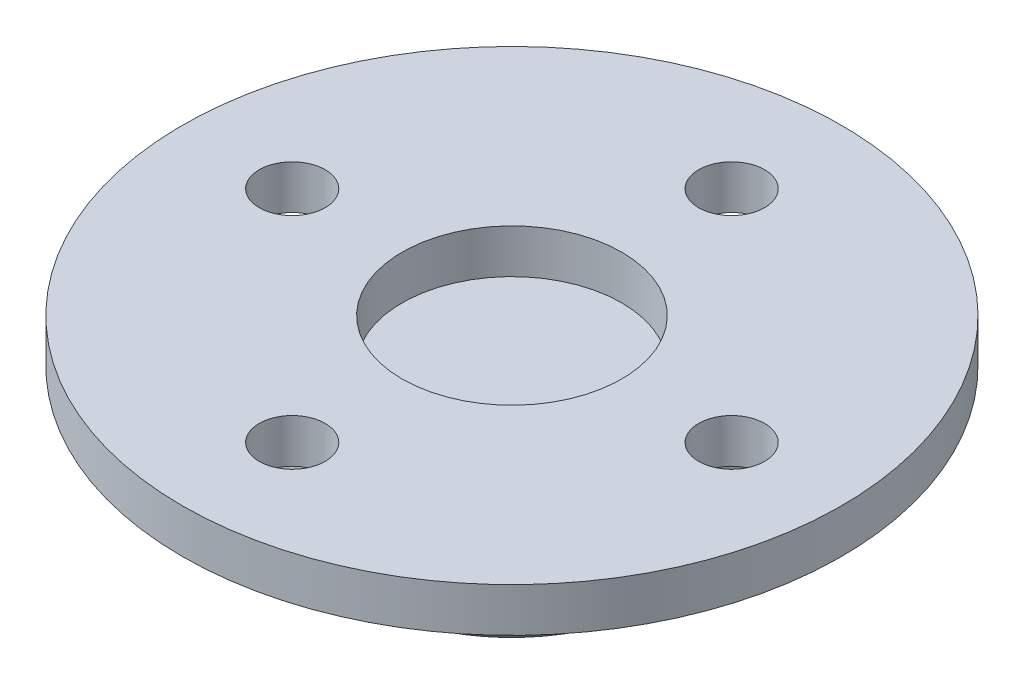
ISO-10303-21;
HEADER;
FILE_DESCRIPTION(('STEP AP214'),'2;1');
FILE_NAME('part.step','',(''),(''),'','','');
FILE_SCHEMA(('AUTOMOTIVE_DESIGN { 1 0 10303 214 1 1 1 1 }'));
ENDSEC;
DATA;
#1=APPLICATION_CONTEXT('core data for automotive mechanical design processes');
#2=APPLICATION_PROTOCOL_DEFINITION('international standard','automotive_design',2000,#1);
#3=PRODUCT_CONTEXT('',#1,'mechanical');
#4=PRODUCT('Part','Part','',(#3));
#5=PRODUCT_RELATED_PRODUCT_CATEGORY('part','',(#4));
#6=PRODUCT_DEFINITION_FORMATION('','',#4);
#7=PRODUCT_DEFINITION_CONTEXT('part definition',#1,'design');
#8=PRODUCT_DEFINITION('design','',#6,#7);
#9=PRODUCT_DEFINITION_SHAPE('','',#8);
#10=(LENGTH_UNIT() NAMED_UNIT(*) SI_UNIT(.MILLI.,.METRE.));
#11=(NAMED_UNIT(*) PLANE_ANGLE_UNIT() SI_UNIT($,.RADIAN.));
#12=(NAMED_UNIT(*) SI_UNIT($,.STERADIAN.) SOLID_ANGLE_UNIT());
#13=UNCERTAINTY_MEASURE_WITH_UNIT(LENGTH_MEASURE(1.E-05),#10,'distance_accuracy_value','');
#14=(GEOMETRIC_REPRESENTATION_CONTEXT(3) GLOBAL_UNCERTAINTY_ASSIGNED_CONTEXT((#13)) GLOBAL_UNIT_ASSIGNED_CONTEXT((#10,
#11,#12)) REPRESENTATION_CONTEXT('',''));
#15=CARTESIAN_POINT('',(0.,0.,0.));
#16=DIRECTION('',(0.,0.,1.));
#17=DIRECTION('',(1.,0.,0.));
#18=AXIS2_PLACEMENT_3D('',#15,#16,#17);
#19=CARTESIAN_POINT('',(0.,-2.54,0.));
#20=DIRECTION('',(0.,1.,0.));
#21=DIRECTION('',(0.,0.,1.));
#22=AXIS2_PLACEMENT_3D('',#19,#20,#21);
#23=CYLINDRICAL_SURFACE('',#22,19.05);
#24=CARTESIAN_POINT('',(0.,-2.54,0.));
#25=DIRECTION('',(0.,1.,0.));
#26=DIRECTION('',(0.,0.,1.));
#27=AXIS2_PLACEMENT_3D('',#24,#25,#26);
#28=CIRCLE('',#27,19.05);
#29=CARTESIAN_POINT('',(0.,-2.54,19.05));
#30=VERTEX_POINT('',#29);
#31=EDGE_CURVE('E59',#30,#30,#28,.T.);
#32=ORIENTED_EDGE('',*,*,#31,.T.);
#33=EDGE_LOOP('',(#32));
#34=FACE_BOUND('',#33,.T.);
#35=CARTESIAN_POINT('',(0.,0.,0.));
#36=DIRECTION('',(0.,1.,0.));
#37=DIRECTION('',(0.,0.,1.));
#38=AXIS2_PLACEMENT_3D('',#35,#36,#37);
#39=CIRCLE('',#38,19.05);
#40=CARTESIAN_POINT('',(0.,0.,19.05));
#41=VERTEX_POINT('',#40);
#42=EDGE_CURVE('E60',#41,#41,#39,.T.);
#43=ORIENTED_EDGE('',*,*,#42,.F.);
#44=EDGE_LOOP('',(#43));
#45=FACE_BOUND('',#44,.T.);
#46=ADVANCED_FACE('F39',(#34,#45),#23,.T.);
#47=CARTESIAN_POINT('',(0.,-2.54,0.));
#48=DIRECTION('',(0.,1.,0.));
#49=DIRECTION('',(0.,0.,1.));
#50=AXIS2_PLACEMENT_3D('',#47,#48,#49);
#51=PLANE('',#50);
#52=CARTESIAN_POINT('',(0.,-2.54,0.));
#53=DIRECTION('',(0.,1.,0.));
#54=DIRECTION('',(0.,0.,1.));
#55=AXIS2_PLACEMENT_3D('',#52,#53,#54);
#56=CIRCLE('',#55,10.16);
#57=CARTESIAN_POINT('',(0.,-2.54,10.16));
#58=VERTEX_POINT('',#57);
#59=EDGE_CURVE('E53',#58,#58,#56,.F.);
#60=ORIENTED_EDGE('',*,*,#59,.F.);
#61=EDGE_LOOP('',(#60));
#62=FACE_BOUND('',#61,.T.);
#63=CARTESIAN_POINT('',(-12.6999999999996,-2.54,3.60178059048672E-13));
#64=DIRECTION('',(0.,1.,0.));
#65=DIRECTION('',(0.,0.,1.));
#66=AXIS2_PLACEMENT_3D('',#63,#64,#65);
#67=CIRCLE('',#66,1.90500000000058);
#68=CARTESIAN_POINT('',(-12.6999999999996,-2.54,1.90500000000094));
#69=VERTEX_POINT('',#68);
#70=EDGE_CURVE('E96',#69,#69,#67,.T.);
#71=ORIENTED_EDGE('',*,*,#70,.T.);
#72=EDGE_LOOP('',(#71));
#73=FACE_BOUND('',#72,.T.);
#74=CARTESIAN_POINT('',(7.1724551522751E-13,-2.54,12.7));
#75=DIRECTION('',(0.,1.,0.));
#76=DIRECTION('',(0.,0.,1.));
#77=AXIS2_PLACEMENT_3D('',#74,#75,#76);
#78=CIRCLE('',#77,1.90500000000077);
#79=CARTESIAN_POINT('',(7.1724551522751E-13,-2.54,14.6050000000008));
#80=VERTEX_POINT('',#79);
#81=EDGE_CURVE('E88',#80,#80,#78,.T.);
#82=ORIENTED_EDGE('',*,*,#81,.T.);
#83=EDGE_LOOP('',(#82));
#84=FACE_BOUND('',#83,.T.);
#85=CARTESIAN_POINT('',(12.7000000000004,-2.54,-3.58622757613755E-13));
#86=DIRECTION('',(0.,1.,0.));
#87=DIRECTION('',(0.,0.,1.));
#88=AXIS2_PLACEMENT_3D('',#85,#86,#87);
#89=CIRCLE('',#88,1.90500000000028);
#90=CARTESIAN_POINT('',(12.7000000000004,-2.54,1.90499999999992));
#91=VERTEX_POINT('',#90);
#92=EDGE_CURVE('E80',#91,#91,#89,.T.);
#93=ORIENTED_EDGE('',*,*,#92,.T.);
#94=EDGE_LOOP('',(#93));
#95=FACE_BOUND('',#94,.T.);
#96=CARTESIAN_POINT('',(0.,-2.54,-12.7));
#97=DIRECTION('',(0.,1.,0.));
#98=DIRECTION('',(0.,0.,1.));
#99=AXIS2_PLACEMENT_3D('',#96,#97,#98);
#100=CIRCLE('',#99,1.905);
#101=CARTESIAN_POINT('',(0.,-2.54,-10.795));
#102=VERTEX_POINT('',#101);
#103=EDGE_CURVE('E72',#102,#102,#100,.T.);
#104=ORIENTED_EDGE('',*,*,#103,.T.);
#105=EDGE_LOOP('',(#104));
#106=FACE_BOUND('',#105,.T.);
#107=ORIENTED_EDGE('',*,*,#31,.F.);
#108=EDGE_LOOP('',(#107));
#109=FACE_BOUND('',#108,.T.);
#110=ADVANCED_FACE('F108',(#62,#73,#84,#95,#106,#109),#51,.F.);
#111=CARTESIAN_POINT('',(0.,0.,0.));
#112=DIRECTION('',(0.,1.,0.));
#113=DIRECTION('',(0.,0.,1.));
#114=AXIS2_PLACEMENT_3D('',#111,#112,#113);
#115=PLANE('',#114);
#116=CARTESIAN_POINT('',(-12.6999999999996,0.,3.60178059048672E-13));
#117=DIRECTION('',(0.,1.,0.));
#118=DIRECTION('',(0.,0.,1.));
#119=AXIS2_PLACEMENT_3D('',#116,#117,#118);
#120=CIRCLE('',#119,1.90500000000058);
#121=CARTESIAN_POINT('',(-12.6999999999996,0.,1.90500000000094));
#122=VERTEX_POINT('',#121);
#123=EDGE_CURVE('E100',#122,#122,#120,.T.);
#124=ORIENTED_EDGE('',*,*,#123,.F.);
#125=EDGE_LOOP('',(#124));
#126=FACE_BOUND('',#125,.T.);
#127=CARTESIAN_POINT('',(7.1724551522751E-13,0.,12.7));
#128=DIRECTION('',(0.,1.,0.));
#129=DIRECTION('',(0.,0.,1.));
#130=AXIS2_PLACEMENT_3D('',#127,#128,#129);
#131=CIRCLE('',#130,1.90500000000077);
#132=CARTESIAN_POINT('',(7.1724551522751E-13,0.,14.6050000000008));
#133=VERTEX_POINT('',#132);
#134=EDGE_CURVE('E92',#133,#133,#131,.T.);
#135=ORIENTED_EDGE('',*,*,#134,.F.);
#136=EDGE_LOOP('',(#135));
#137=FACE_BOUND('',#136,.T.);
#138=CARTESIAN_POINT('',(12.7000000000004,0.,-3.58622757613755E-13));
#139=DIRECTION('',(0.,1.,0.));
#140=DIRECTION('',(0.,0.,1.));
#141=AXIS2_PLACEMENT_3D('',#138,#139,#140);
#142=CIRCLE('',#141,1.90500000000028);
#143=CARTESIAN_POINT('',(12.7000000000004,0.,1.90499999999992));
#144=VERTEX_POINT('',#143);
#145=EDGE_CURVE('E84',#144,#144,#142,.T.);
#146=ORIENTED_EDGE('',*,*,#145,.F.);
#147=EDGE_LOOP('',(#146));
#148=FACE_BOUND('',#147,.T.);
#149=CARTESIAN_POINT('',(0.,0.,-12.7));
#150=DIRECTION('',(0.,1.,0.));
#151=DIRECTION('',(0.,0.,1.));
#152=AXIS2_PLACEMENT_3D('',#149,#150,#151);
#153=CIRCLE('',#152,1.905);
#154=CARTESIAN_POINT('',(0.,0.,-10.795));
#155=VERTEX_POINT('',#154);
#156=EDGE_CURVE('E76',#155,#155,#153,.T.);
#157=ORIENTED_EDGE('',*,*,#156,.F.);
#158=EDGE_LOOP('',(#157));
#159=FACE_BOUND('',#158,.T.);
#160=CARTESIAN_POINT('',(0.,0.,0.));
#161=DIRECTION('',(0.,1.,0.));
#162=DIRECTION('',(0.,0.,1.));
#163=AXIS2_PLACEMENT_3D('',#160,#161,#162);
#164=CIRCLE('',#163,6.35);
#165=CARTESIAN_POINT('',(0.,0.,6.35));
#166=VERTEX_POINT('',#165);
#167=EDGE_CURVE('E68',#166,#166,#164,.T.);
#168=ORIENTED_EDGE('',*,*,#167,.F.);
#169=EDGE_LOOP('',(#168));
#170=FACE_BOUND('',#169,.T.);
#171=ORIENTED_EDGE('',*,*,#42,.T.);
#172=EDGE_LOOP('',(#171));
#173=FACE_BOUND('',#172,.T.);
#174=ADVANCED_FACE('F119',(#126,#137,#148,#159,#170,#173),#115,.T.);
#175=CARTESIAN_POINT('',(0.,-2.54,0.));
#176=DIRECTION('',(0.,1.,0.));
#177=DIRECTION('',(0.,0.,1.));
#178=AXIS2_PLACEMENT_3D('',#175,#176,#177);
#179=CYLINDRICAL_SURFACE('',#178,6.35);
#180=CARTESIAN_POINT('',(0.,-2.54,0.));
#181=DIRECTION('',(0.,1.,0.));
#182=DIRECTION('',(0.,0.,1.));
#183=AXIS2_PLACEMENT_3D('',#180,#181,#182);
#184=CIRCLE('',#183,6.35);
#185=CARTESIAN_POINT('',(0.,-2.54,6.35));
#186=VERTEX_POINT('',#185);
#187=EDGE_CURVE('E64',#186,#186,#184,.T.);
#188=ORIENTED_EDGE('',*,*,#187,.F.);
#189=EDGE_LOOP('',(#188));
#190=FACE_BOUND('',#189,.T.);
#191=ORIENTED_EDGE('',*,*,#167,.T.);
#192=EDGE_LOOP('',(#191));
#193=FACE_BOUND('',#192,.T.);
#194=ADVANCED_FACE('F122',(#190,#193),#179,.F.);
#195=CARTESIAN_POINT('',(0.,-2.54,-12.7));
#196=DIRECTION('',(0.,1.,0.));
#197=DIRECTION('',(0.,0.,1.));
#198=AXIS2_PLACEMENT_3D('',#195,#196,#197);
#199=CYLINDRICAL_SURFACE('',#198,1.905);
#200=ORIENTED_EDGE('',*,*,#103,.F.);
#201=EDGE_LOOP('',(#200));
#202=FACE_BOUND('',#201,.T.);
#203=ORIENTED_EDGE('',*,*,#156,.T.);
#204=EDGE_LOOP('',(#203));
#205=FACE_BOUND('',#204,.T.);
#206=ADVANCED_FACE('F144',(#202,#205),#199,.F.);
#207=CARTESIAN_POINT('',(12.7000000000004,-2.54,-3.58622757613755E-13));
#208=DIRECTION('',(0.,1.,0.));
#209=DIRECTION('',(0.,0.,1.));
#210=AXIS2_PLACEMENT_3D('',#207,#208,#209);
#211=CYLINDRICAL_SURFACE('',#210,1.90500000000028);
#212=ORIENTED_EDGE('',*,*,#92,.F.);
#213=EDGE_LOOP('',(#212));
#214=FACE_BOUND('',#213,.T.);
#215=ORIENTED_EDGE('',*,*,#145,.T.);
#216=EDGE_LOOP('',(#215));
#217=FACE_BOUND('',#216,.T.);
#218=ADVANCED_FACE('F148',(#214,#217),#211,.F.);
#219=CARTESIAN_POINT('',(7.1724551522751E-13,-2.54,12.7));
#220=DIRECTION('',(0.,1.,0.));
#221=DIRECTION('',(0.,0.,1.));
#222=AXIS2_PLACEMENT_3D('',#219,#220,#221);
#223=CYLINDRICAL_SURFACE('',#222,1.90500000000077);
#224=ORIENTED_EDGE('',*,*,#81,.F.);
#225=EDGE_LOOP('',(#224));
#226=FACE_BOUND('',#225,.T.);
#227=ORIENTED_EDGE('',*,*,#134,.T.);
#228=EDGE_LOOP('',(#227));
#229=FACE_BOUND('',#228,.T.);
#230=ADVANCED_FACE('F115',(#226,#229),#223,.F.);
#231=CARTESIAN_POINT('',(-12.6999999999996,-2.54,3.60178059048672E-13));
#232=DIRECTION('',(0.,1.,0.));
#233=DIRECTION('',(0.,0.,1.));
#234=AXIS2_PLACEMENT_3D('',#231,#232,#233);
#235=CYLINDRICAL_SURFACE('',#234,1.90500000000058);
#236=ORIENTED_EDGE('',*,*,#70,.F.);
#237=EDGE_LOOP('',(#236));
#238=FACE_BOUND('',#237,.T.);
#239=ORIENTED_EDGE('',*,*,#123,.T.);
#240=EDGE_LOOP('',(#239));
#241=FACE_BOUND('',#240,.T.);
#242=ADVANCED_FACE('F111',(#238,#241),#235,.F.);
#243=CARTESIAN_POINT('',(0.,-2.54,0.));
#244=DIRECTION('',(0.,-1.,0.));
#245=DIRECTION('',(0.,0.,-1.));
#246=AXIS2_PLACEMENT_3D('',#243,#244,#245);
#247=PLANE('',#246);
#248=ORIENTED_EDGE('',*,*,#187,.T.);
#249=EDGE_LOOP('',(#248));
#250=FACE_BOUND('',#249,.T.);
#251=ADVANCED_FACE('F114',(#250),#247,.F.);
#252=CARTESIAN_POINT('',(0.,-10.16,0.));
#253=DIRECTION('',(0.,1.,0.));
#254=DIRECTION('',(0.,0.,1.));
#255=AXIS2_PLACEMENT_3D('',#252,#253,#254);
#256=CYLINDRICAL_SURFACE('',#255,10.16);
#257=CARTESIAN_POINT('',(0.,-7.62,0.));
#258=DIRECTION('',(0.,-1.,0.));
#259=DIRECTION('',(0.,0.,-1.));
#260=AXIS2_PLACEMENT_3D('',#257,#258,#259);
#261=CIRCLE('',#260,10.16);
#262=CARTESIAN_POINT('',(0.,-7.62,10.16));
#263=VERTEX_POINT('',#262);
#264=EDGE_CURVE('E10',#263,#263,#261,.F.);
#265=CARTESIAN_POINT('',(0.,-7.62,10.16));
#266=CARTESIAN_POINT('',(0.,-7.56708333333333,10.16));
#267=CARTESIAN_POINT('',(0.,-7.51416666666666,10.16));
#268=CARTESIAN_POINT('',(0.,-7.40833333333333,10.16));
#269=CARTESIAN_POINT('',(0.,-7.35541666666666,10.16));
#270=CARTESIAN_POINT('',(0.,-7.24958333333333,10.16));
#271=CARTESIAN_POINT('',(0.,-7.19666666666666,10.16));
#272=CARTESIAN_POINT('',(0.,-7.09083333333333,10.16));
#273=CARTESIAN_POINT('',(0.,-7.03791666666666,10.16));
#274=CARTESIAN_POINT('',(0.,-6.93208333333333,10.16));
#275=CARTESIAN_POINT('',(0.,-6.87916666666667,10.16));
#276=CARTESIAN_POINT('',(0.,-6.77333333333333,10.16));
#277=CARTESIAN_POINT('',(0.,-6.72041666666667,10.16));
#278=CARTESIAN_POINT('',(0.,-6.61458333333333,10.16));
#279=CARTESIAN_POINT('',(0.,-6.56166666666667,10.16));
#280=CARTESIAN_POINT('',(0.,-6.45583333333333,10.16));
#281=CARTESIAN_POINT('',(0.,-6.40291666666667,10.16));
#282=CARTESIAN_POINT('',(0.,-6.29708333333333,10.16));
#283=CARTESIAN_POINT('',(0.,-6.24416666666667,10.16));
#284=CARTESIAN_POINT('',(0.,-6.13833333333333,10.16));
#285=CARTESIAN_POINT('',(0.,-6.08541666666667,10.16));
#286=CARTESIAN_POINT('',(0.,-5.97958333333333,10.16));
#287=CARTESIAN_POINT('',(0.,-5.92666666666667,10.16));
#288=CARTESIAN_POINT('',(0.,-5.82083333333333,10.16));
#289=CARTESIAN_POINT('',(0.,-5.76791666666667,10.16));
#290=CARTESIAN_POINT('',(0.,-5.66208333333333,10.16));
#291=CARTESIAN_POINT('',(0.,-5.60916666666667,10.16));
#292=CARTESIAN_POINT('',(0.,-5.50333333333333,10.16));
#293=CARTESIAN_POINT('',(0.,-5.45041666666667,10.16));
#294=CARTESIAN_POINT('',(0.,-5.34458333333333,10.16));
#295=CARTESIAN_POINT('',(0.,-5.29166666666667,10.16));
#296=CARTESIAN_POINT('',(0.,-5.18583333333333,10.16));
#297=CARTESIAN_POINT('',(0.,-5.13291666666667,10.16));
#298=CARTESIAN_POINT('',(0.,-5.02708333333333,10.16));
#299=CARTESIAN_POINT('',(0.,-4.97416666666667,10.16));
#300=CARTESIAN_POINT('',(0.,-4.86833333333333,10.16));
#301=CARTESIAN_POINT('',(0.,-4.81541666666667,10.16));
#302=CARTESIAN_POINT('',(0.,-4.70958333333333,10.16));
#303=CARTESIAN_POINT('',(0.,-4.65666666666667,10.16));
#304=CARTESIAN_POINT('',(0.,-4.55083333333333,10.16));
#305=CARTESIAN_POINT('',(0.,-4.49791666666667,10.16));
#306=CARTESIAN_POINT('',(0.,-4.39208333333333,10.16));
#307=CARTESIAN_POINT('',(0.,-4.33916666666667,10.16));
#308=CARTESIAN_POINT('',(0.,-4.23333333333333,10.16));
#309=CARTESIAN_POINT('',(0.,-4.18041666666667,10.16));
#310=CARTESIAN_POINT('',(0.,-4.07458333333333,10.16));
#311=CARTESIAN_POINT('',(0.,-4.02166666666667,10.16));
#312=CARTESIAN_POINT('',(0.,-3.91583333333333,10.16));
#313=CARTESIAN_POINT('',(0.,-3.86291666666667,10.16));
#314=CARTESIAN_POINT('',(0.,-3.75708333333333,10.16));
#315=CARTESIAN_POINT('',(0.,-3.70416666666667,10.16));
#316=CARTESIAN_POINT('',(0.,-3.59833333333333,10.16));
#317=CARTESIAN_POINT('',(0.,-3.54541666666667,10.16));
#318=CARTESIAN_POINT('',(0.,-3.43958333333333,10.16));
#319=CARTESIAN_POINT('',(0.,-3.38666666666667,10.16));
#320=CARTESIAN_POINT('',(0.,-3.28083333333333,10.16));
#321=CARTESIAN_POINT('',(0.,-3.22791666666667,10.16));
#322=CARTESIAN_POINT('',(0.,-3.12208333333333,10.16));
#323=CARTESIAN_POINT('',(0.,-3.06916666666667,10.16));
#324=CARTESIAN_POINT('',(0.,-2.96333333333333,10.16));
#325=CARTESIAN_POINT('',(0.,-2.91041666666667,10.16));
#326=CARTESIAN_POINT('',(0.,-2.80458333333333,10.16));
#327=CARTESIAN_POINT('',(0.,-2.75166666666667,10.16));
#328=CARTESIAN_POINT('',(0.,-2.64583333333333,10.16));
#329=CARTESIAN_POINT('',(0.,-2.59291666666667,10.16));
#330=CARTESIAN_POINT('',(0.,-2.54,10.16));
#331=B_SPLINE_CURVE_WITH_KNOTS('',3,(#265,#266,#267,#268,#269,#270,#271,#272,#273,#274,#275,
#276,#277,#278,#279,#280,#281,#282,#283,#284,#285,#286,#287,#288,#289,#290,#291,#292,#293,#294,
#295,#296,#297,#298,#299,#300,#301,#302,#303,#304,#305,#306,#307,#308,#309,#310,#311,#312,#313,
#314,#315,#316,#317,#318,#319,#320,#321,#322,#323,#324,#325,#326,#327,#328,#329,#330),
.UNSPECIFIED.,.F.,.F.,(4,2,2,2,2,2,2,2,2,2,2,2,2,2,2,2,2,2,2,2,2,2,2,2,2,2,2,2,2,2,2,2,4),(0.,
0.158750000000001,0.3175,0.47625,0.635,0.793749999999999,0.9525,1.11125,1.27,1.42875,1.5875,
1.74625,1.905,2.06375,2.2225,2.38125,2.54,2.69875,2.8575,3.01625,3.175,3.33375,3.4925,3.65125,
3.81,3.96875,4.1275,4.28625,4.445,4.60375,4.7625,4.92125,5.08),.UNSPECIFIED.);
#332=EDGE_CURVE('BSEAM156',#263,#58,#331,.T.);
#333=ORIENTED_EDGE('',*,*,#264,.T.);
#334=ORIENTED_EDGE('',*,*,#59,.T.);
#335=ORIENTED_EDGE('',*,*,#332,.T.);
#336=ORIENTED_EDGE('',*,*,#332,.F.);
#337=EDGE_LOOP('',(#333,#335,#334,#336));
#338=FACE_BOUND('',#337,.T.);
#339=ADVANCED_FACE('F156',(#338),#256,.T.);
#340=CARTESIAN_POINT('',(0.,-10.16,0.));
#341=DIRECTION('',(0.,-1.,0.));
#342=DIRECTION('',(0.,0.,-1.));
#343=AXIS2_PLACEMENT_3D('',#340,#341,#342);
#344=PLANE('',#343);
#345=CARTESIAN_POINT('',(0.,-10.16,0.));
#346=DIRECTION('',(0.,-1.,0.));
#347=DIRECTION('',(0.,0.,-1.));
#348=AXIS2_PLACEMENT_3D('',#345,#346,#347);
#349=CIRCLE('',#348,6.35);
#350=CARTESIAN_POINT('',(0.,-10.16,-6.35));
#351=VERTEX_POINT('',#350);
#352=EDGE_CURVE('E43',#351,#351,#349,.T.);
#353=ORIENTED_EDGE('',*,*,#352,.F.);
#354=EDGE_LOOP('',(#353));
#355=FACE_BOUND('',#354,.T.);
#356=CARTESIAN_POINT('',(0.,-10.16,0.));
#357=DIRECTION('',(0.,-1.,0.));
#358=DIRECTION('',(0.,0.,-1.));
#359=AXIS2_PLACEMENT_3D('',#356,#357,#358);
#360=CIRCLE('',#359,7.62);
#361=CARTESIAN_POINT('',(0.,-10.16,-7.62));
#362=VERTEX_POINT('',#361);
#363=EDGE_CURVE('E48',#362,#362,#360,.T.);
#364=ORIENTED_EDGE('',*,*,#363,.T.);
#365=EDGE_LOOP('',(#364));
#366=FACE_BOUND('',#365,.T.);
#367=ADVANCED_FACE('F159',(#355,#366),#344,.T.);
#368=CARTESIAN_POINT('',(0.,-7.62,0.));
#369=DIRECTION('',(0.,-1.,0.));
#370=DIRECTION('',(0.,0.,-1.));
#371=AXIS2_PLACEMENT_3D('',#368,#369,#370);
#372=TOROIDAL_SURFACE('',#371,7.62,2.54);
#373=ORIENTED_EDGE('',*,*,#264,.F.);
#374=EDGE_LOOP('',(#373));
#375=FACE_BOUND('',#374,.T.);
#376=ORIENTED_EDGE('',*,*,#363,.F.);
#377=EDGE_LOOP('',(#376));
#378=FACE_BOUND('',#377,.T.);
#379=ADVANCED_FACE('F41',(#375,#378),#372,.T.);
#380=CARTESIAN_POINT('',(0.,-10.16,0.));
#381=DIRECTION('',(0.,0.,-1.));
#382=DIRECTION('',(-1.,0.,0.));
#383=AXIS2_PLACEMENT_3D('',#380,#381,#382);
#384=SPHERICAL_SURFACE('',#383,6.35);
#385=CARTESIAN_POINT('',(0.,-10.16,0.));
#386=DIRECTION('',(0.,-1.,0.));
#387=DIRECTION('',(0.,0.,-1.));
#388=AXIS2_PLACEMENT_3D('',#385,#386,#387);
#389=SPHERICAL_SURFACE('',#388,6.35);
#390=ORIENTED_EDGE('',*,*,#352,.T.);
#391=EDGE_LOOP('',(#390));
#392=FACE_BOUND('',#391,.T.);
#393=ADVANCED_FACE('F166',(#392),#389,.F.);
#394=CLOSED_SHELL('',(#46,#110,#174,#194,#206,#218,#230,#242,#251,#339,#367,#379,#393));
#395=MANIFOLD_SOLID_BREP('B2',#394);
#396=ADVANCED_BREP_SHAPE_REPRESENTATION('',(#18,#395),#14);
#397=SHAPE_DEFINITION_REPRESENTATION(#9,#396);
ENDSEC;
END-ISO-10303-21;
